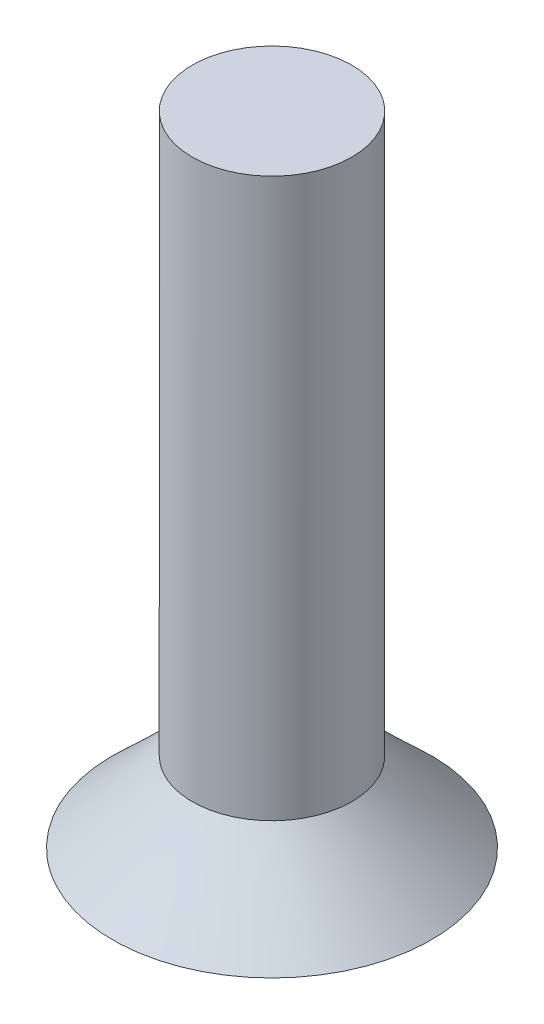
ISO-10303-21;
HEADER;
FILE_DESCRIPTION(('STEP AP214'),'2;1');
FILE_NAME('part.step','',(''),(''),'','','');
FILE_SCHEMA(('AUTOMOTIVE_DESIGN { 1 0 10303 214 1 1 1 1 }'));
ENDSEC;
DATA;
#1=APPLICATION_CONTEXT('core data for automotive mechanical design processes');
#2=APPLICATION_PROTOCOL_DEFINITION('international standard','automotive_design',2000,#1);
#3=PRODUCT_CONTEXT('',#1,'mechanical');
#4=PRODUCT('Part','Part','',(#3));
#5=PRODUCT_RELATED_PRODUCT_CATEGORY('part','',(#4));
#6=PRODUCT_DEFINITION_FORMATION('','',#4);
#7=PRODUCT_DEFINITION_CONTEXT('part definition',#1,'design');
#8=PRODUCT_DEFINITION('design','',#6,#7);
#9=PRODUCT_DEFINITION_SHAPE('','',#8);
#10=(LENGTH_UNIT() NAMED_UNIT(*) SI_UNIT(.MILLI.,.METRE.));
#11=(NAMED_UNIT(*) PLANE_ANGLE_UNIT() SI_UNIT($,.RADIAN.));
#12=(NAMED_UNIT(*) SI_UNIT($,.STERADIAN.) SOLID_ANGLE_UNIT());
#13=UNCERTAINTY_MEASURE_WITH_UNIT(LENGTH_MEASURE(1.E-05),#10,'distance_accuracy_value','');
#14=(GEOMETRIC_REPRESENTATION_CONTEXT(3) GLOBAL_UNCERTAINTY_ASSIGNED_CONTEXT((#13)) GLOBAL_UNIT_ASSIGNED_CONTEXT((#10,
#11,#12)) REPRESENTATION_CONTEXT('',''));
#15=CARTESIAN_POINT('',(0.,0.,0.));
#16=DIRECTION('',(0.,0.,1.));
#17=DIRECTION('',(1.,0.,0.));
#18=AXIS2_PLACEMENT_3D('',#15,#16,#17);
#19=CARTESIAN_POINT('',(0.,0.,0.));
#20=DIRECTION('',(0.,1.,0.));
#21=DIRECTION('',(0.,0.,1.));
#22=AXIS2_PLACEMENT_3D('',#19,#20,#21);
#23=PLANE('',#22);
#24=DIRECTION('',(-0.5,0.,0.866025403784439));
#25=VECTOR('',#24,1.);
#26=CARTESIAN_POINT('',(1.44337567297406,0.,0.));
#27=LINE('',#26,#25);
#28=CARTESIAN_POINT('',(1.44337567297406,0.,0.));
#29=VERTEX_POINT('',#28);
#30=CARTESIAN_POINT('',(0.721687836487033,0.,1.25));
#31=VERTEX_POINT('',#30);
#32=EDGE_CURVE('E151',#29,#31,#27,.T.);
#33=ORIENTED_EDGE('',*,*,#32,.F.);
#34=DIRECTION('',(0.5,0.,0.866025403784439));
#35=VECTOR('',#34,1.);
#36=CARTESIAN_POINT('',(0.721687836487032,0.,-1.25));
#37=LINE('',#36,#35);
#38=CARTESIAN_POINT('',(0.721687836487032,0.,-1.25));
#39=VERTEX_POINT('',#38);
#40=EDGE_CURVE('E72',#39,#29,#37,.T.);
#41=ORIENTED_EDGE('',*,*,#40,.F.);
#42=DIRECTION('',(1.,0.,0.));
#43=VECTOR('',#42,1.);
#44=CARTESIAN_POINT('',(-0.721687836487033,0.,-1.25));
#45=LINE('',#44,#43);
#46=CARTESIAN_POINT('',(-0.721687836487033,0.,-1.25));
#47=VERTEX_POINT('',#46);
#48=EDGE_CURVE('E163',#47,#39,#45,.T.);
#49=ORIENTED_EDGE('',*,*,#48,.F.);
#50=DIRECTION('',(0.5,0.,-0.866025403784439));
#51=VECTOR('',#50,1.);
#52=CARTESIAN_POINT('',(-1.44337567297406,0.,0.));
#53=LINE('',#52,#51);
#54=CARTESIAN_POINT('',(-1.44337567297406,0.,0.));
#55=VERTEX_POINT('',#54);
#56=EDGE_CURVE('E161',#55,#47,#53,.T.);
#57=ORIENTED_EDGE('',*,*,#56,.F.);
#58=DIRECTION('',(-0.5,0.,-0.866025403784439));
#59=VECTOR('',#58,1.);
#60=CARTESIAN_POINT('',(-0.721687836487032,0.,1.25));
#61=LINE('',#60,#59);
#62=CARTESIAN_POINT('',(-0.721687836487032,0.,1.25));
#63=VERTEX_POINT('',#62);
#64=EDGE_CURVE('E118',#63,#55,#61,.T.);
#65=ORIENTED_EDGE('',*,*,#64,.F.);
#66=DIRECTION('',(-1.,0.,0.));
#67=VECTOR('',#66,1.);
#68=CARTESIAN_POINT('',(0.721687836487033,0.,1.25));
#69=LINE('',#68,#67);
#70=EDGE_CURVE('E154',#31,#63,#69,.T.);
#71=ORIENTED_EDGE('',*,*,#70,.F.);
#72=EDGE_LOOP('',(#33,#41,#49,#57,#65,#71));
#73=FACE_BOUND('',#72,.T.);
#74=CARTESIAN_POINT('',(0.,0.,0.));
#75=DIRECTION('',(0.,1.,0.));
#76=DIRECTION('',(0.,0.,1.));
#77=AXIS2_PLACEMENT_3D('',#74,#75,#76);
#78=CIRCLE('',#77,3.);
#79=CARTESIAN_POINT('',(2.27999326585578,0.,-1.9497770917857));
#80=VERTEX_POINT('',#79);
#81=EDGE_CURVE('E63',#80,#80,#78,.T.);
#82=ORIENTED_EDGE('',*,*,#81,.F.);
#83=EDGE_LOOP('',(#82));
#84=FACE_BOUND('',#83,.T.);
#85=ADVANCED_FACE('F51',(#73,#84),#23,.F.);
#86=CARTESIAN_POINT('',(2.27999326585578,0.,-1.9497770917857));
#87=CARTESIAN_POINT('',(0.694387173597943,1.5,-1.32959634970267));
#88=CARTESIAN_POINT('',(-1.61956091771562,0.,-6.50976362349725));
#89=CARTESIAN_POINT('',(-1.9648055258074,1.5,-2.71837069689855));
#90=CARTESIAN_POINT('',(-6.17954744942717,0.,-2.61020943992586));
#91=CARTESIAN_POINT('',(-3.35357987300328,1.5,-0.0591779974932166));
#92=CARTESIAN_POINT('',(-2.27999326585578,0.,1.9497770917857));
#93=CARTESIAN_POINT('',(-0.694387173597942,1.5,1.32959634970267));
#94=CARTESIAN_POINT('',(1.61956091771562,0.,6.50976362349726));
#95=CARTESIAN_POINT('',(1.96480552580739,1.5,2.71837069689855));
#96=CARTESIAN_POINT('',(6.17954744942718,0.,2.61020943992586));
#97=CARTESIAN_POINT('',(3.35357987300328,1.5,0.0591779974932155));
#98=CARTESIAN_POINT('',(2.27999326585578,0.,-1.9497770917857));
#99=CARTESIAN_POINT('',(0.694387173597943,1.5,-1.32959634970267));
#100=(BOUNDED_SURFACE() B_SPLINE_SURFACE(3,1,((#86,#87),(#88,#89),(#90,#91),(#92,#93),(#94,#95),
(#96,#97),(#98,#99)),.UNSPECIFIED.,.T.,.F.,.F.) B_SPLINE_SURFACE_WITH_KNOTS((4,3,4),(2,2),(0.,
0.5,1.),(0.,1.),.UNSPECIFIED.) GEOMETRIC_REPRESENTATION_ITEM() RATIONAL_B_SPLINE_SURFACE(((1.,
1.),(0.333333333333334,0.333333333333333),(0.333333333333334,0.333333333333333),(1.,1.),
(0.333333333333333,0.333333333333333),(0.333333333333333,0.333333333333333),(1.,1.))) REPRESENTATION_ITEM('') SURFACE());
#101=CARTESIAN_POINT('',(0.,1.5,0.));
#102=DIRECTION('',(0.,1.,0.));
#103=DIRECTION('',(0.,0.,1.));
#104=AXIS2_PLACEMENT_3D('',#101,#102,#103);
#105=CIRCLE('',#104,1.5);
#106=CARTESIAN_POINT('',(0.694387173597943,1.5,-1.32959634970267));
#107=VERTEX_POINT('',#106);
#108=EDGE_CURVE('E12',#107,#107,#105,.T.);
#109=CARTESIAN_POINT('',(2.27999326585578,0.,-1.9497770917857));
#110=CARTESIAN_POINT('',(2.26347653572809,0.015625,-1.94331687572234));
#111=CARTESIAN_POINT('',(2.24695980560041,0.03125,-1.93685665965897));
#112=CARTESIAN_POINT('',(2.21392634534504,0.0625,-1.92393622753224));
#113=CARTESIAN_POINT('',(2.19740961521735,0.078125,-1.91747601146888));
#114=CARTESIAN_POINT('',(2.16437615496198,0.109375,-1.90455557934215));
#115=CARTESIAN_POINT('',(2.14785942483429,0.125,-1.89809536327878));
#116=CARTESIAN_POINT('',(2.11482596457892,0.15625,-1.88517493115205));
#117=CARTESIAN_POINT('',(2.09830923445123,0.171875,-1.87871471508869));
#118=CARTESIAN_POINT('',(2.06527577419586,0.203125,-1.86579428296196));
#119=CARTESIAN_POINT('',(2.04875904406818,0.21875,-1.85933406689859));
#120=CARTESIAN_POINT('',(2.01572558381281,0.25,-1.84641363477186));
#121=CARTESIAN_POINT('',(1.99920885368512,0.265625,-1.8399534187085));
#122=CARTESIAN_POINT('',(1.96617539342975,0.296875,-1.82703298658177));
#123=CARTESIAN_POINT('',(1.94965866330206,0.3125,-1.8205727705184));
#124=CARTESIAN_POINT('',(1.91662520304669,0.34375,-1.80765233839167));
#125=CARTESIAN_POINT('',(1.90010847291901,0.359375,-1.80119212232831));
#126=CARTESIAN_POINT('',(1.86707501266363,0.390625,-1.78827169020158));
#127=CARTESIAN_POINT('',(1.85055828253595,0.40625,-1.78181147413821));
#128=CARTESIAN_POINT('',(1.81752482228058,0.4375,-1.76889104201148));
#129=CARTESIAN_POINT('',(1.80100809215289,0.453125,-1.76243082594812));
#130=CARTESIAN_POINT('',(1.76797463189752,0.484375,-1.74951039382139));
#131=CARTESIAN_POINT('',(1.75145790176983,0.5,-1.74305017775802));
#132=CARTESIAN_POINT('',(1.71842444151446,0.53125,-1.73012974563129));
#133=CARTESIAN_POINT('',(1.70190771138678,0.546875,-1.72366952956793));
#134=CARTESIAN_POINT('',(1.6688742511314,0.578125,-1.7107490974412));
#135=CARTESIAN_POINT('',(1.65235752100372,0.59375,-1.70428888137783));
#136=CARTESIAN_POINT('',(1.61932406074835,0.625,-1.6913684492511));
#137=CARTESIAN_POINT('',(1.60280733062066,0.640625,-1.68490823318774));
#138=CARTESIAN_POINT('',(1.56977387036529,0.671875,-1.67198780106101));
#139=CARTESIAN_POINT('',(1.5532571402376,0.6875,-1.66552758499764));
#140=CARTESIAN_POINT('',(1.52022367998223,0.71875,-1.65260715287091));
#141=CARTESIAN_POINT('',(1.50370694985455,0.734375,-1.64614693680755));
#142=CARTESIAN_POINT('',(1.47067348959917,0.765625,-1.63322650468082));
#143=CARTESIAN_POINT('',(1.45415675947149,0.78125,-1.62676628861745));
#144=CARTESIAN_POINT('',(1.42112329921612,0.8125,-1.61384585649072));
#145=CARTESIAN_POINT('',(1.40460656908843,0.828125,-1.60738564042736));
#146=CARTESIAN_POINT('',(1.37157310883306,0.859375,-1.59446520830063));
#147=CARTESIAN_POINT('',(1.35505637870537,0.875,-1.58800499223726));
#148=CARTESIAN_POINT('',(1.32202291845,0.90625,-1.57508456011054));
#149=CARTESIAN_POINT('',(1.30550618832232,0.921875,-1.56862434404717));
#150=CARTESIAN_POINT('',(1.27247272806695,0.953125,-1.55570391192044));
#151=CARTESIAN_POINT('',(1.25595599793926,0.96875,-1.54924369585708));
#152=CARTESIAN_POINT('',(1.22292253768389,1.,-1.53632326373035));
#153=CARTESIAN_POINT('',(1.2064058075562,1.015625,-1.52986304766698));
#154=CARTESIAN_POINT('',(1.17337234730083,1.046875,-1.51694261554025));
#155=CARTESIAN_POINT('',(1.15685561717314,1.0625,-1.51048239947689));
#156=CARTESIAN_POINT('',(1.12382215691777,1.09375,-1.49756196735016));
#157=CARTESIAN_POINT('',(1.10730542679009,1.109375,-1.49110175128679));
#158=CARTESIAN_POINT('',(1.07427196653472,1.140625,-1.47818131916006));
#159=CARTESIAN_POINT('',(1.05775523640703,1.15625,-1.4717211030967));
#160=CARTESIAN_POINT('',(1.02472177615166,1.1875,-1.45880067096997));
#161=CARTESIAN_POINT('',(1.00820504602397,1.203125,-1.4523404549066));
#162=CARTESIAN_POINT('',(0.975171585768601,1.234375,-1.43942002277987));
#163=CARTESIAN_POINT('',(0.958654855640915,1.25,-1.43295980671651));
#164=CARTESIAN_POINT('',(0.925621395385544,1.28125,-1.42003937458978));
#165=CARTESIAN_POINT('',(0.909104665257858,1.296875,-1.41357915852641));
#166=CARTESIAN_POINT('',(0.876071205002486,1.328125,-1.40065872639968));
#167=CARTESIAN_POINT('',(0.859554474874801,1.34375,-1.39419851033632));
#168=CARTESIAN_POINT('',(0.826521014619429,1.375,-1.38127807820959));
#169=CARTESIAN_POINT('',(0.810004284491743,1.390625,-1.37481786214622));
#170=CARTESIAN_POINT('',(0.776970824236372,1.421875,-1.36189743001949));
#171=CARTESIAN_POINT('',(0.760454094108686,1.4375,-1.35543721395613));
#172=CARTESIAN_POINT('',(0.727420633853314,1.46875,-1.3425167818294));
#173=CARTESIAN_POINT('',(0.710903903725628,1.484375,-1.33605656576603));
#174=CARTESIAN_POINT('',(0.694387173597943,1.5,-1.32959634970267));
#175=B_SPLINE_CURVE_WITH_KNOTS('',3,(#109,#110,#111,#112,#113,#114,#115,#116,#117,#118,#119,
#120,#121,#122,#123,#124,#125,#126,#127,#128,#129,#130,#131,#132,#133,#134,#135,#136,#137,#138,
#139,#140,#141,#142,#143,#144,#145,#146,#147,#148,#149,#150,#151,#152,#153,#154,#155,#156,#157,
#158,#159,#160,#161,#162,#163,#164,#165,#166,#167,#168,#169,#170,#171,#172,#173,#174),
.UNSPECIFIED.,.F.,.F.,(4,2,2,2,2,2,2,2,2,2,2,2,2,2,2,2,2,2,2,2,2,2,2,2,2,2,2,2,2,2,2,2,4),(0.,
0.0709090721717993,0.141818144343599,0.212727216515398,0.283636288687198,0.354545360858997,
0.425454433030796,0.496363505202596,0.567272577374395,0.638181649546194,0.709090721717994,
0.779999793889793,0.850908866061593,0.921817938233392,0.992727010405191,1.06363608257699,
1.13454515474879,1.20545422692059,1.27636329909239,1.34727237126419,1.41818144343599,
1.48909051560779,1.55999958777959,1.63090865995139,1.70181773212319,1.77272680429498,
1.84363587646678,1.91454494863858,1.98545402081038,2.05636309298218,2.12727216515398,
2.19818123732578,2.26909030949758),.UNSPECIFIED.);
#176=EDGE_CURVE('BSEAM52',#80,#107,#175,.T.);
#177=ORIENTED_EDGE('',*,*,#81,.T.);
#178=ORIENTED_EDGE('',*,*,#108,.F.);
#179=ORIENTED_EDGE('',*,*,#176,.T.);
#180=ORIENTED_EDGE('',*,*,#176,.F.);
#181=EDGE_LOOP('',(#177,#179,#178,#180));
#182=FACE_BOUND('',#181,.T.);
#183=ADVANCED_FACE('F52',(#182),#100,.T.);
#184=CARTESIAN_POINT('',(0.,12.,0.));
#185=DIRECTION('',(0.,-1.,0.));
#186=DIRECTION('',(0.,0.,-1.));
#187=AXIS2_PLACEMENT_3D('',#184,#185,#186);
#188=CYLINDRICAL_SURFACE('',#187,1.5);
#189=CARTESIAN_POINT('',(0.,12.,0.));
#190=DIRECTION('',(0.,1.,0.));
#191=DIRECTION('',(0.,0.,1.));
#192=AXIS2_PLACEMENT_3D('',#189,#190,#191);
#193=CIRCLE('',#192,1.5);
#194=CARTESIAN_POINT('',(0.,12.,1.5));
#195=VERTEX_POINT('',#194);
#196=EDGE_CURVE('E168',#195,#195,#193,.T.);
#197=ORIENTED_EDGE('',*,*,#196,.F.);
#198=EDGE_LOOP('',(#197));
#199=FACE_BOUND('',#198,.T.);
#200=ORIENTED_EDGE('',*,*,#108,.T.);
#201=EDGE_LOOP('',(#200));
#202=FACE_BOUND('',#201,.T.);
#203=ADVANCED_FACE('F222',(#199,#202),#188,.T.);
#204=CARTESIAN_POINT('',(0.,12.,0.));
#205=DIRECTION('',(0.,1.,0.));
#206=DIRECTION('',(0.,0.,1.));
#207=AXIS2_PLACEMENT_3D('',#204,#205,#206);
#208=PLANE('',#207);
#209=ORIENTED_EDGE('',*,*,#196,.T.);
#210=EDGE_LOOP('',(#209));
#211=FACE_BOUND('',#210,.T.);
#212=ADVANCED_FACE('F223',(#211),#208,.T.);
#213=CARTESIAN_POINT('',(0.721687836487032,1.,-1.25));
#214=DIRECTION('',(0.866025403784439,0.,-0.5));
#215=DIRECTION('',(-0.5,0.,-0.866025403784439));
#216=AXIS2_PLACEMENT_3D('',#213,#214,#215);
#217=PLANE('',#216);
#218=ORIENTED_EDGE('',*,*,#40,.T.);
#219=DIRECTION('',(0.,-1.,0.));
#220=VECTOR('',#219,1.);
#221=CARTESIAN_POINT('',(1.44337567297406,1.,0.));
#222=LINE('',#221,#220);
#223=CARTESIAN_POINT('',(1.44337567297406,1.,0.));
#224=VERTEX_POINT('',#223);
#225=EDGE_CURVE('E101',#224,#29,#222,.T.);
#226=ORIENTED_EDGE('',*,*,#225,.F.);
#227=DIRECTION('',(0.5,0.,0.866025403784439));
#228=VECTOR('',#227,1.);
#229=CARTESIAN_POINT('',(0.721687836487032,1.,-1.25));
#230=LINE('',#229,#228);
#231=CARTESIAN_POINT('',(0.721687836487032,1.,-1.25));
#232=VERTEX_POINT('',#231);
#233=EDGE_CURVE('E170',#232,#224,#230,.T.);
#234=ORIENTED_EDGE('',*,*,#233,.F.);
#235=DIRECTION('',(0.,-1.,0.));
#236=VECTOR('',#235,1.);
#237=CARTESIAN_POINT('',(0.721687836487032,1.,-1.25));
#238=LINE('',#237,#236);
#239=EDGE_CURVE('E78',#232,#39,#238,.T.);
#240=ORIENTED_EDGE('',*,*,#239,.T.);
#241=EDGE_LOOP('',(#218,#226,#234,#240));
#242=FACE_BOUND('',#241,.T.);
#243=ADVANCED_FACE('F238',(#242),#217,.F.);
#244=CARTESIAN_POINT('',(-0.721687836487033,1.,-1.25));
#245=DIRECTION('',(0.,0.,-1.));
#246=DIRECTION('',(-1.,0.,0.));
#247=AXIS2_PLACEMENT_3D('',#244,#245,#246);
#248=PLANE('',#247);
#249=ORIENTED_EDGE('',*,*,#48,.T.);
#250=ORIENTED_EDGE('',*,*,#239,.F.);
#251=DIRECTION('',(1.,0.,0.));
#252=VECTOR('',#251,1.);
#253=CARTESIAN_POINT('',(-0.721687836487033,1.,-1.25));
#254=LINE('',#253,#252);
#255=CARTESIAN_POINT('',(-0.721687836487033,1.,-1.25));
#256=VERTEX_POINT('',#255);
#257=EDGE_CURVE('E135',#256,#232,#254,.T.);
#258=ORIENTED_EDGE('',*,*,#257,.F.);
#259=DIRECTION('',(0.,-1.,0.));
#260=VECTOR('',#259,1.);
#261=CARTESIAN_POINT('',(-0.721687836487033,1.,-1.25));
#262=LINE('',#261,#260);
#263=EDGE_CURVE('E121',#256,#47,#262,.T.);
#264=ORIENTED_EDGE('',*,*,#263,.T.);
#265=EDGE_LOOP('',(#249,#250,#258,#264));
#266=FACE_BOUND('',#265,.T.);
#267=ADVANCED_FACE('F243',(#266),#248,.F.);
#268=CARTESIAN_POINT('',(-1.44337567297406,1.,0.));
#269=DIRECTION('',(-0.866025403784439,0.,-0.5));
#270=DIRECTION('',(-0.5,0.,0.866025403784439));
#271=AXIS2_PLACEMENT_3D('',#268,#269,#270);
#272=PLANE('',#271);
#273=ORIENTED_EDGE('',*,*,#56,.T.);
#274=ORIENTED_EDGE('',*,*,#263,.F.);
#275=DIRECTION('',(0.5,0.,-0.866025403784439));
#276=VECTOR('',#275,1.);
#277=CARTESIAN_POINT('',(-1.44337567297406,1.,0.));
#278=LINE('',#277,#276);
#279=CARTESIAN_POINT('',(-1.44337567297406,1.,0.));
#280=VERTEX_POINT('',#279);
#281=EDGE_CURVE('E126',#280,#256,#278,.T.);
#282=ORIENTED_EDGE('',*,*,#281,.F.);
#283=DIRECTION('',(0.,-1.,0.));
#284=VECTOR('',#283,1.);
#285=CARTESIAN_POINT('',(-1.44337567297406,1.,0.));
#286=LINE('',#285,#284);
#287=EDGE_CURVE('E115',#280,#55,#286,.T.);
#288=ORIENTED_EDGE('',*,*,#287,.T.);
#289=EDGE_LOOP('',(#273,#274,#282,#288));
#290=FACE_BOUND('',#289,.T.);
#291=ADVANCED_FACE('F129',(#290),#272,.F.);
#292=CARTESIAN_POINT('',(-0.721687836487032,1.,1.25));
#293=DIRECTION('',(-0.866025403784439,0.,0.5));
#294=DIRECTION('',(0.5,0.,0.866025403784439));
#295=AXIS2_PLACEMENT_3D('',#292,#293,#294);
#296=PLANE('',#295);
#297=ORIENTED_EDGE('',*,*,#64,.T.);
#298=ORIENTED_EDGE('',*,*,#287,.F.);
#299=DIRECTION('',(-0.5,0.,-0.866025403784439));
#300=VECTOR('',#299,1.);
#301=CARTESIAN_POINT('',(-0.721687836487032,1.,1.25));
#302=LINE('',#301,#300);
#303=CARTESIAN_POINT('',(-0.721687836487032,1.,1.25));
#304=VERTEX_POINT('',#303);
#305=EDGE_CURVE('E119',#304,#280,#302,.T.);
#306=ORIENTED_EDGE('',*,*,#305,.F.);
#307=DIRECTION('',(0.,-1.,0.));
#308=VECTOR('',#307,1.);
#309=CARTESIAN_POINT('',(-0.721687836487032,1.,1.25));
#310=LINE('',#309,#308);
#311=EDGE_CURVE('E123',#304,#63,#310,.T.);
#312=ORIENTED_EDGE('',*,*,#311,.T.);
#313=EDGE_LOOP('',(#297,#298,#306,#312));
#314=FACE_BOUND('',#313,.T.);
#315=ADVANCED_FACE('F111',(#314),#296,.F.);
#316=CARTESIAN_POINT('',(0.721687836487033,1.,1.25));
#317=DIRECTION('',(0.,0.,1.));
#318=DIRECTION('',(1.,0.,0.));
#319=AXIS2_PLACEMENT_3D('',#316,#317,#318);
#320=PLANE('',#319);
#321=ORIENTED_EDGE('',*,*,#70,.T.);
#322=ORIENTED_EDGE('',*,*,#311,.F.);
#323=DIRECTION('',(-1.,0.,0.));
#324=VECTOR('',#323,1.);
#325=CARTESIAN_POINT('',(0.721687836487033,1.,1.25));
#326=LINE('',#325,#324);
#327=CARTESIAN_POINT('',(0.721687836487033,1.,1.25));
#328=VERTEX_POINT('',#327);
#329=EDGE_CURVE('E136',#328,#304,#326,.T.);
#330=ORIENTED_EDGE('',*,*,#329,.F.);
#331=DIRECTION('',(0.,-1.,0.));
#332=VECTOR('',#331,1.);
#333=CARTESIAN_POINT('',(0.721687836487033,1.,1.25));
#334=LINE('',#333,#332);
#335=EDGE_CURVE('E172',#328,#31,#334,.T.);
#336=ORIENTED_EDGE('',*,*,#335,.T.);
#337=EDGE_LOOP('',(#321,#322,#330,#336));
#338=FACE_BOUND('',#337,.T.);
#339=ADVANCED_FACE('F249',(#338),#320,.F.);
#340=CARTESIAN_POINT('',(1.44337567297406,1.,0.));
#341=DIRECTION('',(0.866025403784439,0.,0.5));
#342=DIRECTION('',(0.5,0.,-0.866025403784439));
#343=AXIS2_PLACEMENT_3D('',#340,#341,#342);
#344=PLANE('',#343);
#345=ORIENTED_EDGE('',*,*,#32,.T.);
#346=ORIENTED_EDGE('',*,*,#335,.F.);
#347=DIRECTION('',(-0.5,0.,0.866025403784439));
#348=VECTOR('',#347,1.);
#349=CARTESIAN_POINT('',(1.44337567297406,1.,0.));
#350=LINE('',#349,#348);
#351=EDGE_CURVE('E141',#224,#328,#350,.T.);
#352=ORIENTED_EDGE('',*,*,#351,.F.);
#353=ORIENTED_EDGE('',*,*,#225,.T.);
#354=EDGE_LOOP('',(#345,#346,#352,#353));
#355=FACE_BOUND('',#354,.T.);
#356=ADVANCED_FACE('F242',(#355),#344,.F.);
#357=CARTESIAN_POINT('',(0.,1.,0.));
#358=DIRECTION('',(0.,-1.,0.));
#359=DIRECTION('',(0.,0.,-1.));
#360=AXIS2_PLACEMENT_3D('',#357,#358,#359);
#361=PLANE('',#360);
#362=ORIENTED_EDGE('',*,*,#233,.T.);
#363=ORIENTED_EDGE('',*,*,#351,.T.);
#364=ORIENTED_EDGE('',*,*,#329,.T.);
#365=ORIENTED_EDGE('',*,*,#305,.T.);
#366=ORIENTED_EDGE('',*,*,#281,.T.);
#367=ORIENTED_EDGE('',*,*,#257,.T.);
#368=EDGE_LOOP('',(#362,#363,#364,#365,#366,#367));
#369=FACE_BOUND('',#368,.T.);
#370=ADVANCED_FACE('F137',(#369),#361,.T.);
#371=CLOSED_SHELL('',(#85,#183,#203,#212,#243,#267,#291,#315,#339,#356,#370));
#372=MANIFOLD_SOLID_BREP('B2',#371);
#373=ADVANCED_BREP_SHAPE_REPRESENTATION('',(#18,#372),#14);
#374=SHAPE_DEFINITION_REPRESENTATION(#9,#373);
ENDSEC;
END-ISO-10303-21;
